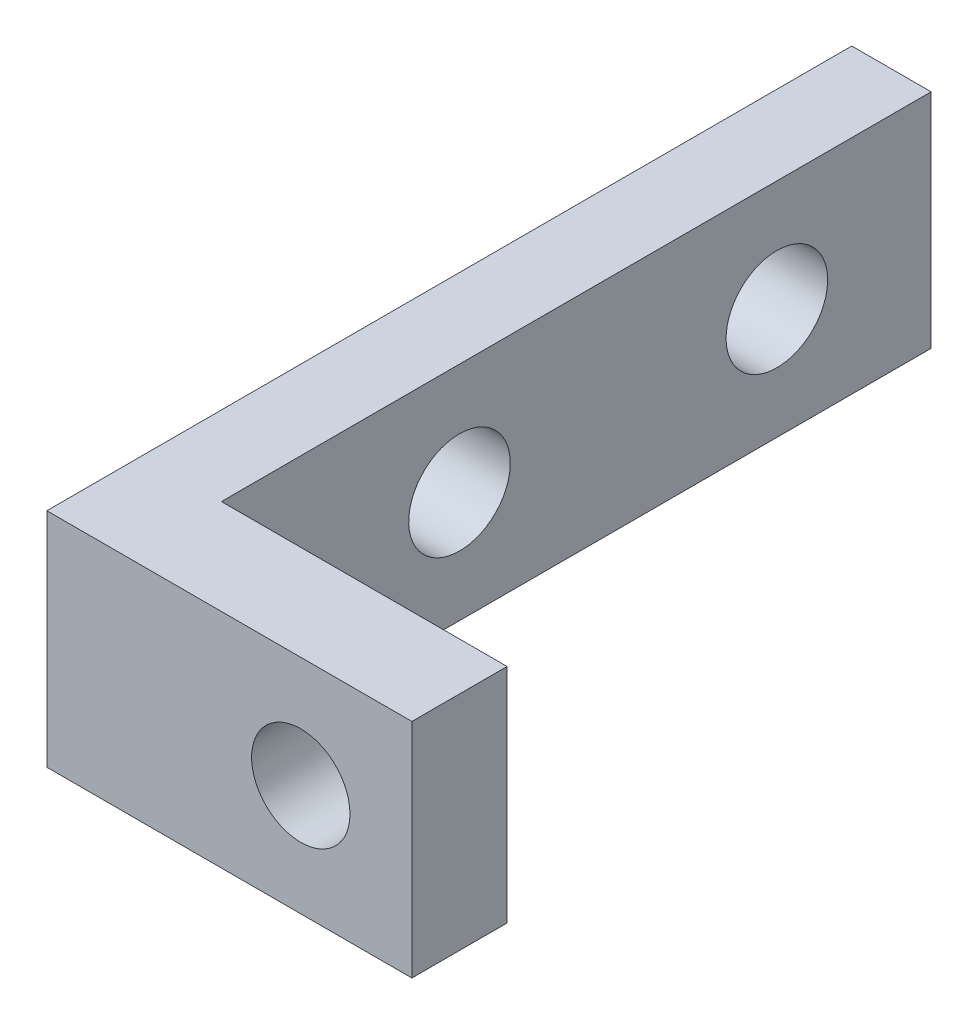
ISO-10303-21;
HEADER;
FILE_DESCRIPTION(('STEP AP214'),'2;1');
FILE_NAME('part.step','',(''),(''),'','','');
FILE_SCHEMA(('AUTOMOTIVE_DESIGN { 1 0 10303 214 1 1 1 1 }'));
ENDSEC;
DATA;
#1=APPLICATION_CONTEXT('core data for automotive mechanical design processes');
#2=APPLICATION_PROTOCOL_DEFINITION('international standard','automotive_design',2000,#1);
#3=PRODUCT_CONTEXT('',#1,'mechanical');
#4=PRODUCT('Part','Part','',(#3));
#5=PRODUCT_RELATED_PRODUCT_CATEGORY('part','',(#4));
#6=PRODUCT_DEFINITION_FORMATION('','',#4);
#7=PRODUCT_DEFINITION_CONTEXT('part definition',#1,'design');
#8=PRODUCT_DEFINITION('design','',#6,#7);
#9=PRODUCT_DEFINITION_SHAPE('','',#8);
#10=(LENGTH_UNIT() NAMED_UNIT(*) SI_UNIT(.MILLI.,.METRE.));
#11=(NAMED_UNIT(*) PLANE_ANGLE_UNIT() SI_UNIT($,.RADIAN.));
#12=(NAMED_UNIT(*) SI_UNIT($,.STERADIAN.) SOLID_ANGLE_UNIT());
#13=UNCERTAINTY_MEASURE_WITH_UNIT(LENGTH_MEASURE(1.E-05),#10,'distance_accuracy_value','');
#14=(GEOMETRIC_REPRESENTATION_CONTEXT(3) GLOBAL_UNCERTAINTY_ASSIGNED_CONTEXT((#13)) GLOBAL_UNIT_ASSIGNED_CONTEXT((#10,
#11,#12)) REPRESENTATION_CONTEXT('',''));
#15=CARTESIAN_POINT('',(0.,0.,0.));
#16=DIRECTION('',(0.,0.,1.));
#17=DIRECTION('',(1.,0.,0.));
#18=AXIS2_PLACEMENT_3D('',#15,#16,#17);
#19=CARTESIAN_POINT('',(19.15,53.7672502122995,-19.36));
#20=DIRECTION('',(-1.,0.,0.));
#21=DIRECTION('',(0.,-1.,0.));
#22=AXIS2_PLACEMENT_3D('',#19,#20,#21);
#23=PLANE('',#22);
#24=CARTESIAN_POINT('',(19.15,1.26725021229947,-4.5));
#25=DIRECTION('',(1.,0.,0.));
#26=DIRECTION('',(0.,-1.,0.));
#27=AXIS2_PLACEMENT_3D('',#24,#25,#26);
#28=CIRCLE('',#27,1.6);
#29=CARTESIAN_POINT('',(19.15,2.86725021229947,-4.5));
#30=VERTEX_POINT('',#29);
#31=EDGE_CURVE('E125',#30,#30,#28,.T.);
#32=ORIENTED_EDGE('',*,*,#31,.F.);
#33=EDGE_LOOP('',(#32));
#34=FACE_BOUND('',#33,.T.);
#35=CARTESIAN_POINT('',(19.15,1.26725021229947,-14.5));
#36=DIRECTION('',(1.,0.,0.));
#37=DIRECTION('',(0.,-1.,0.));
#38=AXIS2_PLACEMENT_3D('',#35,#36,#37);
#39=CIRCLE('',#38,1.6);
#40=CARTESIAN_POINT('',(19.15,2.86725021229947,-14.5));
#41=VERTEX_POINT('',#40);
#42=EDGE_CURVE('E121',#41,#41,#39,.T.);
#43=ORIENTED_EDGE('',*,*,#42,.F.);
#44=EDGE_LOOP('',(#43));
#45=FACE_BOUND('',#44,.T.);
#46=DIRECTION('',(0.,0.,1.));
#47=VECTOR('',#46,1.);
#48=CARTESIAN_POINT('',(19.15,4.76725021229947,-19.36));
#49=LINE('',#48,#47);
#50=CARTESIAN_POINT('',(19.15,4.76725021229947,-19.36));
#51=VERTEX_POINT('',#50);
#52=CARTESIAN_POINT('',(19.15,4.76725021229947,3.));
#53=VERTEX_POINT('',#52);
#54=EDGE_CURVE('E54',#51,#53,#49,.T.);
#55=ORIENTED_EDGE('',*,*,#54,.T.);
#56=DIRECTION('',(0.,-1.,0.));
#57=VECTOR('',#56,1.);
#58=CARTESIAN_POINT('',(19.15,4.76725021229947,3.));
#59=LINE('',#58,#57);
#60=CARTESIAN_POINT('',(19.15,-2.23274978770053,3.));
#61=VERTEX_POINT('',#60);
#62=EDGE_CURVE('E115',#53,#61,#59,.T.);
#63=ORIENTED_EDGE('',*,*,#62,.T.);
#64=DIRECTION('',(0.,0.,1.));
#65=VECTOR('',#64,1.);
#66=CARTESIAN_POINT('',(19.15,-2.23274978770053,-19.36));
#67=LINE('',#66,#65);
#68=CARTESIAN_POINT('',(19.15,-2.23274978770053,-19.36));
#69=VERTEX_POINT('',#68);
#70=EDGE_CURVE('E108',#69,#61,#67,.T.);
#71=ORIENTED_EDGE('',*,*,#70,.F.);
#72=DIRECTION('',(0.,-1.,0.));
#73=VECTOR('',#72,1.);
#74=CARTESIAN_POINT('',(19.15,-2.23274978770053,-19.36));
#75=LINE('',#74,#73);
#76=EDGE_CURVE('E137',#51,#69,#75,.T.);
#77=ORIENTED_EDGE('',*,*,#76,.F.);
#78=EDGE_LOOP('',(#55,#63,#71,#77));
#79=FACE_BOUND('',#78,.T.);
#80=ADVANCED_FACE('F32',(#34,#45,#79),#23,.F.);
#81=CARTESIAN_POINT('',(16.65,53.7672502122995,-19.36));
#82=DIRECTION('',(1.,0.,0.));
#83=DIRECTION('',(0.,1.,0.));
#84=AXIS2_PLACEMENT_3D('',#81,#82,#83);
#85=PLANE('',#84);
#86=CARTESIAN_POINT('',(16.65,1.26725021229947,-4.5));
#87=DIRECTION('',(1.,0.,0.));
#88=DIRECTION('',(0.,1.,0.));
#89=AXIS2_PLACEMENT_3D('',#86,#87,#88);
#90=CIRCLE('',#89,1.6);
#91=CARTESIAN_POINT('',(16.65,2.86725021229947,-4.5));
#92=VERTEX_POINT('',#91);
#93=EDGE_CURVE('E117',#92,#92,#90,.T.);
#94=ORIENTED_EDGE('',*,*,#93,.T.);
#95=EDGE_LOOP('',(#94));
#96=FACE_BOUND('',#95,.T.);
#97=CARTESIAN_POINT('',(16.65,1.26725021229947,-14.5));
#98=DIRECTION('',(1.,0.,0.));
#99=DIRECTION('',(0.,1.,0.));
#100=AXIS2_PLACEMENT_3D('',#97,#98,#99);
#101=CIRCLE('',#100,1.6);
#102=CARTESIAN_POINT('',(16.65,2.86725021229947,-14.5));
#103=VERTEX_POINT('',#102);
#104=EDGE_CURVE('E126',#103,#103,#101,.T.);
#105=ORIENTED_EDGE('',*,*,#104,.T.);
#106=EDGE_LOOP('',(#105));
#107=FACE_BOUND('',#106,.T.);
#108=DIRECTION('',(0.,-1.,0.));
#109=VECTOR('',#108,1.);
#110=CARTESIAN_POINT('',(16.65,77.7672502122995,6.));
#111=LINE('',#110,#109);
#112=CARTESIAN_POINT('',(16.65,4.76725021229947,6.00000000000001));
#113=VERTEX_POINT('',#112);
#114=CARTESIAN_POINT('',(16.65,-2.23274978770053,6.));
#115=VERTEX_POINT('',#114);
#116=EDGE_CURVE('E84',#113,#115,#111,.T.);
#117=ORIENTED_EDGE('',*,*,#116,.F.);
#118=DIRECTION('',(0.,0.,-1.));
#119=VECTOR('',#118,1.);
#120=CARTESIAN_POINT('',(16.65,4.76725021229947,80.));
#121=LINE('',#120,#119);
#122=CARTESIAN_POINT('',(16.65,4.76725021229947,-19.36));
#123=VERTEX_POINT('',#122);
#124=EDGE_CURVE('E35',#113,#123,#121,.T.);
#125=ORIENTED_EDGE('',*,*,#124,.T.);
#126=DIRECTION('',(0.,1.,0.));
#127=VECTOR('',#126,1.);
#128=CARTESIAN_POINT('',(16.65,-2.23274978770053,-19.36));
#129=LINE('',#128,#127);
#130=CARTESIAN_POINT('',(16.65,-2.23274978770053,-19.36));
#131=VERTEX_POINT('',#130);
#132=EDGE_CURVE('E92',#131,#123,#129,.T.);
#133=ORIENTED_EDGE('',*,*,#132,.F.);
#134=DIRECTION('',(0.,0.,-1.));
#135=VECTOR('',#134,1.);
#136=CARTESIAN_POINT('',(16.65,-2.23274978770053,6.));
#137=LINE('',#136,#135);
#138=EDGE_CURVE('E99',#115,#131,#137,.T.);
#139=ORIENTED_EDGE('',*,*,#138,.F.);
#140=EDGE_LOOP('',(#117,#125,#133,#139));
#141=FACE_BOUND('',#140,.T.);
#142=ADVANCED_FACE('F106',(#96,#107,#141),#85,.F.);
#143=CARTESIAN_POINT('',(28.15,77.7672502122995,0.));
#144=DIRECTION('',(1.,0.,0.));
#145=DIRECTION('',(0.,1.,0.));
#146=AXIS2_PLACEMENT_3D('',#143,#144,#145);
#147=PLANE('',#146);
#148=DIRECTION('',(0.,0.,-1.));
#149=VECTOR('',#148,1.);
#150=CARTESIAN_POINT('',(28.15,4.76725021229947,0.));
#151=LINE('',#150,#149);
#152=CARTESIAN_POINT('',(28.15,4.76725021229947,6.00000000000001));
#153=VERTEX_POINT('',#152);
#154=CARTESIAN_POINT('',(28.15,4.76725021229947,3.));
#155=VERTEX_POINT('',#154);
#156=EDGE_CURVE('E11',#153,#155,#151,.T.);
#157=ORIENTED_EDGE('',*,*,#156,.F.);
#158=DIRECTION('',(0.,-1.,0.));
#159=VECTOR('',#158,1.);
#160=CARTESIAN_POINT('',(28.15,77.7672502122995,6.00000000000001));
#161=LINE('',#160,#159);
#162=CARTESIAN_POINT('',(28.15,-2.23274978770053,6.00000000000001));
#163=VERTEX_POINT('',#162);
#164=EDGE_CURVE('E146',#153,#163,#161,.T.);
#165=ORIENTED_EDGE('',*,*,#164,.T.);
#166=DIRECTION('',(0.,0.,1.));
#167=VECTOR('',#166,1.);
#168=CARTESIAN_POINT('',(28.15,-2.23274978770053,0.));
#169=LINE('',#168,#167);
#170=CARTESIAN_POINT('',(28.15,-2.23274978770053,3.));
#171=VERTEX_POINT('',#170);
#172=EDGE_CURVE('E103',#171,#163,#169,.T.);
#173=ORIENTED_EDGE('',*,*,#172,.F.);
#174=DIRECTION('',(0.,-1.,0.));
#175=VECTOR('',#174,1.);
#176=CARTESIAN_POINT('',(28.15,4.76725021229947,3.));
#177=LINE('',#176,#175);
#178=EDGE_CURVE('E119',#155,#171,#177,.T.);
#179=ORIENTED_EDGE('',*,*,#178,.F.);
#180=EDGE_LOOP('',(#157,#165,#173,#179));
#181=FACE_BOUND('',#180,.T.);
#182=ADVANCED_FACE('F154',(#181),#147,.T.);
#183=CARTESIAN_POINT('',(16.65,-2.23274978770053,-19.36));
#184=DIRECTION('',(0.,1.,0.));
#185=DIRECTION('',(-1.,0.,0.));
#186=AXIS2_PLACEMENT_3D('',#183,#184,#185);
#187=PLANE('',#186);
#188=ORIENTED_EDGE('',*,*,#172,.T.);
#189=DIRECTION('',(-1.,0.,0.));
#190=VECTOR('',#189,1.);
#191=CARTESIAN_POINT('',(0.,-2.23274978770053,6.));
#192=LINE('',#191,#190);
#193=EDGE_CURVE('E89',#163,#115,#192,.T.);
#194=ORIENTED_EDGE('',*,*,#193,.T.);
#195=ORIENTED_EDGE('',*,*,#138,.T.);
#196=DIRECTION('',(-1.,0.,0.));
#197=VECTOR('',#196,1.);
#198=CARTESIAN_POINT('',(16.65,-2.23274978770053,-19.36));
#199=LINE('',#198,#197);
#200=EDGE_CURVE('E131',#69,#131,#199,.T.);
#201=ORIENTED_EDGE('',*,*,#200,.F.);
#202=ORIENTED_EDGE('',*,*,#70,.T.);
#203=DIRECTION('',(1.,0.,0.));
#204=VECTOR('',#203,1.);
#205=CARTESIAN_POINT('',(19.15,-2.23274978770053,3.));
#206=LINE('',#205,#204);
#207=EDGE_CURVE('E93',#61,#171,#206,.T.);
#208=ORIENTED_EDGE('',*,*,#207,.T.);
#209=EDGE_LOOP('',(#188,#194,#195,#201,#202,#208));
#210=FACE_BOUND('',#209,.T.);
#211=ADVANCED_FACE('F97',(#210),#187,.F.);
#212=CARTESIAN_POINT('',(0.,0.,6.));
#213=DIRECTION('',(0.,0.,1.));
#214=DIRECTION('',(1.,0.,0.));
#215=AXIS2_PLACEMENT_3D('',#212,#213,#214);
#216=PLANE('',#215);
#217=DIRECTION('',(1.,0.,0.));
#218=VECTOR('',#217,1.);
#219=CARTESIAN_POINT('',(0.,4.76725021229947,6.));
#220=LINE('',#219,#218);
#221=EDGE_CURVE('E40',#113,#153,#220,.T.);
#222=ORIENTED_EDGE('',*,*,#221,.F.);
#223=ORIENTED_EDGE('',*,*,#116,.T.);
#224=ORIENTED_EDGE('',*,*,#193,.F.);
#225=ORIENTED_EDGE('',*,*,#164,.F.);
#226=EDGE_LOOP('',(#222,#223,#224,#225));
#227=FACE_BOUND('',#226,.T.);
#228=CARTESIAN_POINT('',(24.65,1.26725021229947,6.00000000000001));
#229=DIRECTION('',(0.,0.,1.));
#230=DIRECTION('',(1.,0.,0.));
#231=AXIS2_PLACEMENT_3D('',#228,#229,#230);
#232=CIRCLE('',#231,1.55);
#233=CARTESIAN_POINT('',(26.2,1.26725021229947,6.00000000000001));
#234=VERTEX_POINT('',#233);
#235=EDGE_CURVE('E141',#234,#234,#232,.T.);
#236=ORIENTED_EDGE('',*,*,#235,.F.);
#237=EDGE_LOOP('',(#236));
#238=FACE_BOUND('',#237,.T.);
#239=ADVANCED_FACE('F86',(#227,#238),#216,.T.);
#240=CARTESIAN_POINT('',(16.65,4.76725021229947,-19.36));
#241=DIRECTION('',(0.,-1.,0.));
#242=DIRECTION('',(1.,0.,0.));
#243=AXIS2_PLACEMENT_3D('',#240,#241,#242);
#244=PLANE('',#243);
#245=DIRECTION('',(1.,0.,0.));
#246=VECTOR('',#245,1.);
#247=CARTESIAN_POINT('',(16.65,4.76725021229947,-19.36));
#248=LINE('',#247,#246);
#249=EDGE_CURVE('E135',#123,#51,#248,.T.);
#250=ORIENTED_EDGE('',*,*,#249,.F.);
#251=ORIENTED_EDGE('',*,*,#124,.F.);
#252=ORIENTED_EDGE('',*,*,#221,.T.);
#253=ORIENTED_EDGE('',*,*,#156,.T.);
#254=DIRECTION('',(1.,0.,0.));
#255=VECTOR('',#254,1.);
#256=CARTESIAN_POINT('',(0.,4.76725021229947,3.));
#257=LINE('',#256,#255);
#258=EDGE_CURVE('E113',#53,#155,#257,.T.);
#259=ORIENTED_EDGE('',*,*,#258,.F.);
#260=ORIENTED_EDGE('',*,*,#54,.F.);
#261=EDGE_LOOP('',(#250,#251,#252,#253,#259,#260));
#262=FACE_BOUND('',#261,.T.);
#263=ADVANCED_FACE('F150',(#262),#244,.F.);
#264=CARTESIAN_POINT('',(0.,0.,-19.36));
#265=DIRECTION('',(0.,0.,-1.));
#266=DIRECTION('',(-1.,0.,0.));
#267=AXIS2_PLACEMENT_3D('',#264,#265,#266);
#268=PLANE('',#267);
#269=ORIENTED_EDGE('',*,*,#132,.T.);
#270=ORIENTED_EDGE('',*,*,#249,.T.);
#271=ORIENTED_EDGE('',*,*,#76,.T.);
#272=ORIENTED_EDGE('',*,*,#200,.T.);
#273=EDGE_LOOP('',(#269,#270,#271,#272));
#274=FACE_BOUND('',#273,.T.);
#275=ADVANCED_FACE('F162',(#274),#268,.T.);
#276=CARTESIAN_POINT('',(-0.209999999999971,1.26725021229946,-4.5));
#277=DIRECTION('',(1.,0.,0.));
#278=DIRECTION('',(0.,1.,0.));
#279=AXIS2_PLACEMENT_3D('',#276,#277,#278);
#280=CYLINDRICAL_SURFACE('',#279,1.6);
#281=CARTESIAN_POINT('',(19.15,2.86725021229947,-4.5));
#282=CARTESIAN_POINT('',(19.1239583333334,2.86725021229947,-4.5));
#283=CARTESIAN_POINT('',(19.0979166666667,2.86725021229947,-4.5));
#284=CARTESIAN_POINT('',(19.0458333333334,2.86725021229947,-4.5));
#285=CARTESIAN_POINT('',(19.0197916666667,2.86725021229947,-4.5));
#286=CARTESIAN_POINT('',(18.9677083333334,2.86725021229947,-4.5));
#287=CARTESIAN_POINT('',(18.9416666666667,2.86725021229947,-4.5));
#288=CARTESIAN_POINT('',(18.8895833333334,2.86725021229947,-4.5));
#289=CARTESIAN_POINT('',(18.8635416666667,2.86725021229947,-4.5));
#290=CARTESIAN_POINT('',(18.8114583333334,2.86725021229947,-4.5));
#291=CARTESIAN_POINT('',(18.7854166666667,2.86725021229947,-4.5));
#292=CARTESIAN_POINT('',(18.7333333333334,2.86725021229947,-4.5));
#293=CARTESIAN_POINT('',(18.7072916666667,2.86725021229947,-4.5));
#294=CARTESIAN_POINT('',(18.6552083333334,2.86725021229947,-4.5));
#295=CARTESIAN_POINT('',(18.6291666666667,2.86725021229947,-4.5));
#296=CARTESIAN_POINT('',(18.5770833333334,2.86725021229947,-4.5));
#297=CARTESIAN_POINT('',(18.5510416666667,2.86725021229947,-4.5));
#298=CARTESIAN_POINT('',(18.4989583333334,2.86725021229947,-4.5));
#299=CARTESIAN_POINT('',(18.4729166666667,2.86725021229947,-4.5));
#300=CARTESIAN_POINT('',(18.4208333333334,2.86725021229947,-4.5));
#301=CARTESIAN_POINT('',(18.3947916666667,2.86725021229947,-4.5));
#302=CARTESIAN_POINT('',(18.3427083333333,2.86725021229947,-4.5));
#303=CARTESIAN_POINT('',(18.3166666666667,2.86725021229947,-4.5));
#304=CARTESIAN_POINT('',(18.2645833333334,2.86725021229947,-4.5));
#305=CARTESIAN_POINT('',(18.2385416666667,2.86725021229947,-4.5));
#306=CARTESIAN_POINT('',(18.1864583333333,2.86725021229947,-4.5));
#307=CARTESIAN_POINT('',(18.1604166666667,2.86725021229947,-4.5));
#308=CARTESIAN_POINT('',(18.1083333333333,2.86725021229947,-4.5));
#309=CARTESIAN_POINT('',(18.0822916666667,2.86725021229947,-4.5));
#310=CARTESIAN_POINT('',(18.0302083333333,2.86725021229947,-4.5));
#311=CARTESIAN_POINT('',(18.0041666666667,2.86725021229947,-4.5));
#312=CARTESIAN_POINT('',(17.9520833333333,2.86725021229947,-4.5));
#313=CARTESIAN_POINT('',(17.9260416666667,2.86725021229947,-4.5));
#314=CARTESIAN_POINT('',(17.8739583333333,2.86725021229947,-4.5));
#315=CARTESIAN_POINT('',(17.8479166666667,2.86725021229947,-4.5));
#316=CARTESIAN_POINT('',(17.7958333333333,2.86725021229947,-4.5));
#317=CARTESIAN_POINT('',(17.7697916666667,2.86725021229947,-4.5));
#318=CARTESIAN_POINT('',(17.7177083333333,2.86725021229947,-4.5));
#319=CARTESIAN_POINT('',(17.6916666666667,2.86725021229947,-4.5));
#320=CARTESIAN_POINT('',(17.6395833333333,2.86725021229947,-4.5));
#321=CARTESIAN_POINT('',(17.6135416666667,2.86725021229947,-4.5));
#322=CARTESIAN_POINT('',(17.5614583333333,2.86725021229947,-4.5));
#323=CARTESIAN_POINT('',(17.5354166666667,2.86725021229947,-4.5));
#324=CARTESIAN_POINT('',(17.4833333333333,2.86725021229947,-4.5));
#325=CARTESIAN_POINT('',(17.4572916666667,2.86725021229947,-4.5));
#326=CARTESIAN_POINT('',(17.4052083333333,2.86725021229947,-4.5));
#327=CARTESIAN_POINT('',(17.3791666666667,2.86725021229947,-4.5));
#328=CARTESIAN_POINT('',(17.3270833333333,2.86725021229947,-4.5));
#329=CARTESIAN_POINT('',(17.3010416666667,2.86725021229947,-4.5));
#330=CARTESIAN_POINT('',(17.2489583333333,2.86725021229947,-4.5));
#331=CARTESIAN_POINT('',(17.2229166666667,2.86725021229947,-4.5));
#332=CARTESIAN_POINT('',(17.1708333333333,2.86725021229947,-4.5));
#333=CARTESIAN_POINT('',(17.1447916666667,2.86725021229947,-4.5));
#334=CARTESIAN_POINT('',(17.0927083333333,2.86725021229947,-4.5));
#335=CARTESIAN_POINT('',(17.0666666666667,2.86725021229947,-4.5));
#336=CARTESIAN_POINT('',(17.0145833333333,2.86725021229947,-4.5));
#337=CARTESIAN_POINT('',(16.9885416666667,2.86725021229947,-4.5));
#338=CARTESIAN_POINT('',(16.9364583333333,2.86725021229947,-4.5));
#339=CARTESIAN_POINT('',(16.9104166666667,2.86725021229947,-4.5));
#340=CARTESIAN_POINT('',(16.8583333333333,2.86725021229947,-4.5));
#341=CARTESIAN_POINT('',(16.8322916666667,2.86725021229947,-4.5));
#342=CARTESIAN_POINT('',(16.7802083333333,2.86725021229947,-4.5));
#343=CARTESIAN_POINT('',(16.7541666666667,2.86725021229947,-4.5));
#344=CARTESIAN_POINT('',(16.7020833333333,2.86725021229947,-4.5));
#345=CARTESIAN_POINT('',(16.6760416666667,2.86725021229947,-4.5));
#346=CARTESIAN_POINT('',(16.65,2.86725021229947,-4.5));
#347=B_SPLINE_CURVE_WITH_KNOTS('',3,(#281,#282,#283,#284,#285,#286,#287,#288,#289,#290,#291,
#292,#293,#294,#295,#296,#297,#298,#299,#300,#301,#302,#303,#304,#305,#306,#307,#308,#309,#310,
#311,#312,#313,#314,#315,#316,#317,#318,#319,#320,#321,#322,#323,#324,#325,#326,#327,#328,#329,
#330,#331,#332,#333,#334,#335,#336,#337,#338,#339,#340,#341,#342,#343,#344,#345,#346),
.UNSPECIFIED.,.F.,.F.,(4,2,2,2,2,2,2,2,2,2,2,2,2,2,2,2,2,2,2,2,2,2,2,2,2,2,2,2,2,2,2,2,4),(0.,
0.0781250000000018,0.156250000000004,0.234375000000002,0.312500000000004,0.390625000000006,
0.468750000000004,0.546875000000006,0.625000000000008,0.703125000000009,0.781250000000011,
0.859375000000009,0.937500000000011,1.01562500000001,1.09375000000001,1.17187500000001,
1.25000000000002,1.32812500000002,1.40625000000002,1.48437500000002,1.56250000000002,
1.64062500000002,1.71875000000002,1.79687500000002,1.87500000000002,1.95312500000002,
2.03125000000003,2.10937500000002,2.18750000000003,2.26562500000003,2.34375000000003,
2.42187500000003,2.50000000000003),.UNSPECIFIED.);
#348=EDGE_CURVE('BSEAM164',#30,#92,#347,.T.);
#349=ORIENTED_EDGE('',*,*,#31,.T.);
#350=ORIENTED_EDGE('',*,*,#93,.F.);
#351=ORIENTED_EDGE('',*,*,#348,.T.);
#352=ORIENTED_EDGE('',*,*,#348,.F.);
#353=EDGE_LOOP('',(#349,#351,#350,#352));
#354=FACE_BOUND('',#353,.T.);
#355=ADVANCED_FACE('F164',(#354),#280,.F.);
#356=CARTESIAN_POINT('',(-0.209999999999971,1.26725021229946,-14.5));
#357=DIRECTION('',(1.,0.,0.));
#358=DIRECTION('',(0.,1.,0.));
#359=AXIS2_PLACEMENT_3D('',#356,#357,#358);
#360=CYLINDRICAL_SURFACE('',#359,1.6);
#361=CARTESIAN_POINT('',(19.15,2.86725021229947,-14.5));
#362=CARTESIAN_POINT('',(19.1239583333334,2.86725021229947,-14.5));
#363=CARTESIAN_POINT('',(19.0979166666667,2.86725021229947,-14.5));
#364=CARTESIAN_POINT('',(19.0458333333334,2.86725021229947,-14.5));
#365=CARTESIAN_POINT('',(19.0197916666667,2.86725021229947,-14.5));
#366=CARTESIAN_POINT('',(18.9677083333334,2.86725021229947,-14.5));
#367=CARTESIAN_POINT('',(18.9416666666667,2.86725021229947,-14.5));
#368=CARTESIAN_POINT('',(18.8895833333334,2.86725021229947,-14.5));
#369=CARTESIAN_POINT('',(18.8635416666667,2.86725021229947,-14.5));
#370=CARTESIAN_POINT('',(18.8114583333334,2.86725021229947,-14.5));
#371=CARTESIAN_POINT('',(18.7854166666667,2.86725021229947,-14.5));
#372=CARTESIAN_POINT('',(18.7333333333334,2.86725021229947,-14.5));
#373=CARTESIAN_POINT('',(18.7072916666667,2.86725021229947,-14.5));
#374=CARTESIAN_POINT('',(18.6552083333334,2.86725021229947,-14.5));
#375=CARTESIAN_POINT('',(18.6291666666667,2.86725021229947,-14.5));
#376=CARTESIAN_POINT('',(18.5770833333334,2.86725021229947,-14.5));
#377=CARTESIAN_POINT('',(18.5510416666667,2.86725021229947,-14.5));
#378=CARTESIAN_POINT('',(18.4989583333334,2.86725021229947,-14.5));
#379=CARTESIAN_POINT('',(18.4729166666667,2.86725021229947,-14.5));
#380=CARTESIAN_POINT('',(18.4208333333334,2.86725021229947,-14.5));
#381=CARTESIAN_POINT('',(18.3947916666667,2.86725021229947,-14.5));
#382=CARTESIAN_POINT('',(18.3427083333333,2.86725021229947,-14.5));
#383=CARTESIAN_POINT('',(18.3166666666667,2.86725021229947,-14.5));
#384=CARTESIAN_POINT('',(18.2645833333334,2.86725021229947,-14.5));
#385=CARTESIAN_POINT('',(18.2385416666667,2.86725021229947,-14.5));
#386=CARTESIAN_POINT('',(18.1864583333333,2.86725021229947,-14.5));
#387=CARTESIAN_POINT('',(18.1604166666667,2.86725021229947,-14.5));
#388=CARTESIAN_POINT('',(18.1083333333333,2.86725021229947,-14.5));
#389=CARTESIAN_POINT('',(18.0822916666667,2.86725021229947,-14.5));
#390=CARTESIAN_POINT('',(18.0302083333333,2.86725021229947,-14.5));
#391=CARTESIAN_POINT('',(18.0041666666667,2.86725021229947,-14.5));
#392=CARTESIAN_POINT('',(17.9520833333333,2.86725021229947,-14.5));
#393=CARTESIAN_POINT('',(17.9260416666667,2.86725021229947,-14.5));
#394=CARTESIAN_POINT('',(17.8739583333333,2.86725021229947,-14.5));
#395=CARTESIAN_POINT('',(17.8479166666667,2.86725021229947,-14.5));
#396=CARTESIAN_POINT('',(17.7958333333333,2.86725021229947,-14.5));
#397=CARTESIAN_POINT('',(17.7697916666667,2.86725021229947,-14.5));
#398=CARTESIAN_POINT('',(17.7177083333333,2.86725021229947,-14.5));
#399=CARTESIAN_POINT('',(17.6916666666667,2.86725021229947,-14.5));
#400=CARTESIAN_POINT('',(17.6395833333333,2.86725021229947,-14.5));
#401=CARTESIAN_POINT('',(17.6135416666667,2.86725021229947,-14.5));
#402=CARTESIAN_POINT('',(17.5614583333333,2.86725021229947,-14.5));
#403=CARTESIAN_POINT('',(17.5354166666667,2.86725021229947,-14.5));
#404=CARTESIAN_POINT('',(17.4833333333333,2.86725021229947,-14.5));
#405=CARTESIAN_POINT('',(17.4572916666667,2.86725021229947,-14.5));
#406=CARTESIAN_POINT('',(17.4052083333333,2.86725021229947,-14.5));
#407=CARTESIAN_POINT('',(17.3791666666667,2.86725021229947,-14.5));
#408=CARTESIAN_POINT('',(17.3270833333333,2.86725021229947,-14.5));
#409=CARTESIAN_POINT('',(17.3010416666667,2.86725021229947,-14.5));
#410=CARTESIAN_POINT('',(17.2489583333333,2.86725021229947,-14.5));
#411=CARTESIAN_POINT('',(17.2229166666667,2.86725021229947,-14.5));
#412=CARTESIAN_POINT('',(17.1708333333333,2.86725021229947,-14.5));
#413=CARTESIAN_POINT('',(17.1447916666667,2.86725021229947,-14.5));
#414=CARTESIAN_POINT('',(17.0927083333333,2.86725021229947,-14.5));
#415=CARTESIAN_POINT('',(17.0666666666667,2.86725021229947,-14.5));
#416=CARTESIAN_POINT('',(17.0145833333333,2.86725021229947,-14.5));
#417=CARTESIAN_POINT('',(16.9885416666667,2.86725021229947,-14.5));
#418=CARTESIAN_POINT('',(16.9364583333333,2.86725021229947,-14.5));
#419=CARTESIAN_POINT('',(16.9104166666667,2.86725021229947,-14.5));
#420=CARTESIAN_POINT('',(16.8583333333333,2.86725021229947,-14.5));
#421=CARTESIAN_POINT('',(16.8322916666667,2.86725021229947,-14.5));
#422=CARTESIAN_POINT('',(16.7802083333333,2.86725021229947,-14.5));
#423=CARTESIAN_POINT('',(16.7541666666667,2.86725021229947,-14.5));
#424=CARTESIAN_POINT('',(16.7020833333333,2.86725021229947,-14.5));
#425=CARTESIAN_POINT('',(16.6760416666667,2.86725021229947,-14.5));
#426=CARTESIAN_POINT('',(16.65,2.86725021229947,-14.5));
#427=B_SPLINE_CURVE_WITH_KNOTS('',3,(#361,#362,#363,#364,#365,#366,#367,#368,#369,#370,#371,
#372,#373,#374,#375,#376,#377,#378,#379,#380,#381,#382,#383,#384,#385,#386,#387,#388,#389,#390,
#391,#392,#393,#394,#395,#396,#397,#398,#399,#400,#401,#402,#403,#404,#405,#406,#407,#408,#409,
#410,#411,#412,#413,#414,#415,#416,#417,#418,#419,#420,#421,#422,#423,#424,#425,#426),
.UNSPECIFIED.,.F.,.F.,(4,2,2,2,2,2,2,2,2,2,2,2,2,2,2,2,2,2,2,2,2,2,2,2,2,2,2,2,2,2,2,2,4),(0.,
0.0781250000000018,0.156250000000004,0.234375000000002,0.312500000000004,0.390625000000006,
0.468750000000004,0.546875000000006,0.625000000000008,0.703125000000009,0.781250000000011,
0.859375000000009,0.937500000000011,1.01562500000001,1.09375000000001,1.17187500000001,
1.25000000000002,1.32812500000002,1.40625000000002,1.48437500000002,1.56250000000002,
1.64062500000002,1.71875000000002,1.79687500000002,1.87500000000002,1.95312500000002,
2.03125000000003,2.10937500000002,2.18750000000003,2.26562500000003,2.34375000000003,
2.42187500000003,2.50000000000003),.UNSPECIFIED.);
#428=EDGE_CURVE('BSEAM170',#41,#103,#427,.T.);
#429=ORIENTED_EDGE('',*,*,#42,.T.);
#430=ORIENTED_EDGE('',*,*,#104,.F.);
#431=ORIENTED_EDGE('',*,*,#428,.T.);
#432=ORIENTED_EDGE('',*,*,#428,.F.);
#433=EDGE_LOOP('',(#429,#431,#430,#432));
#434=FACE_BOUND('',#433,.T.);
#435=ADVANCED_FACE('F170',(#434),#360,.F.);
#436=CARTESIAN_POINT('',(24.65,1.26725021229947,109.));
#437=DIRECTION('',(0.,0.,-1.));
#438=DIRECTION('',(-1.,0.,0.));
#439=AXIS2_PLACEMENT_3D('',#436,#437,#438);
#440=CYLINDRICAL_SURFACE('',#439,1.55);
#441=CARTESIAN_POINT('',(24.65,1.26725021229947,3.));
#442=DIRECTION('',(0.,0.,1.));
#443=DIRECTION('',(1.,0.,0.));
#444=AXIS2_PLACEMENT_3D('',#441,#442,#443);
#445=CIRCLE('',#444,1.55);
#446=CARTESIAN_POINT('',(26.2,1.26725021229947,3.));
#447=VERTEX_POINT('',#446);
#448=EDGE_CURVE('E124',#447,#447,#445,.F.);
#449=ORIENTED_EDGE('',*,*,#448,.T.);
#450=EDGE_LOOP('',(#449));
#451=FACE_BOUND('',#450,.T.);
#452=ORIENTED_EDGE('',*,*,#235,.T.);
#453=EDGE_LOOP('',(#452));
#454=FACE_BOUND('',#453,.T.);
#455=ADVANCED_FACE('F189',(#451,#454),#440,.F.);
#456=CARTESIAN_POINT('',(0.,0.,3.));
#457=DIRECTION('',(0.,0.,1.));
#458=DIRECTION('',(1.,0.,0.));
#459=AXIS2_PLACEMENT_3D('',#456,#457,#458);
#460=PLANE('',#459);
#461=ORIENTED_EDGE('',*,*,#62,.F.);
#462=ORIENTED_EDGE('',*,*,#258,.T.);
#463=ORIENTED_EDGE('',*,*,#178,.T.);
#464=ORIENTED_EDGE('',*,*,#207,.F.);
#465=EDGE_LOOP('',(#461,#462,#463,#464));
#466=FACE_BOUND('',#465,.T.);
#467=ORIENTED_EDGE('',*,*,#448,.F.);
#468=EDGE_LOOP('',(#467));
#469=FACE_BOUND('',#468,.T.);
#470=ADVANCED_FACE('F158',(#466,#469),#460,.F.);
#471=CLOSED_SHELL('',(#80,#142,#182,#211,#239,#263,#275,#355,#435,#455,#470));
#472=MANIFOLD_SOLID_BREP('B2',#471);
#473=ADVANCED_BREP_SHAPE_REPRESENTATION('',(#18,#472),#14);
#474=SHAPE_DEFINITION_REPRESENTATION(#9,#473);
ENDSEC;
END-ISO-10303-21;
